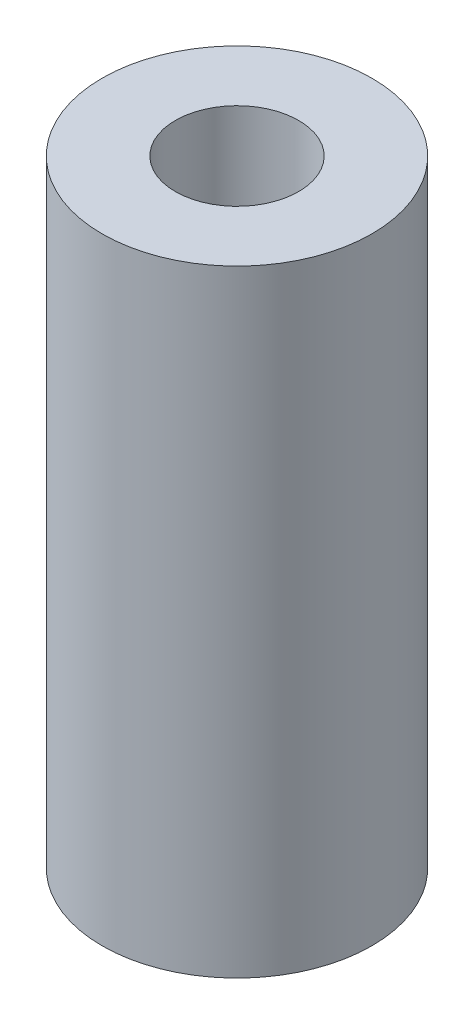
ISO-10303-21;
HEADER;
FILE_DESCRIPTION(('STEP AP214'),'2;1');
FILE_NAME('part.step','',(''),(''),'','','');
FILE_SCHEMA(('AUTOMOTIVE_DESIGN { 1 0 10303 214 1 1 1 1 }'));
ENDSEC;
DATA;
#1=APPLICATION_CONTEXT('core data for automotive mechanical design processes');
#2=APPLICATION_PROTOCOL_DEFINITION('international standard','automotive_design',2000,#1);
#3=PRODUCT_CONTEXT('',#1,'mechanical');
#4=PRODUCT('Part','Part','',(#3));
#5=PRODUCT_RELATED_PRODUCT_CATEGORY('part','',(#4));
#6=PRODUCT_DEFINITION_FORMATION('','',#4);
#7=PRODUCT_DEFINITION_CONTEXT('part definition',#1,'design');
#8=PRODUCT_DEFINITION('design','',#6,#7);
#9=PRODUCT_DEFINITION_SHAPE('','',#8);
#10=(LENGTH_UNIT() NAMED_UNIT(*) SI_UNIT(.MILLI.,.METRE.));
#11=(NAMED_UNIT(*) PLANE_ANGLE_UNIT() SI_UNIT($,.RADIAN.));
#12=(NAMED_UNIT(*) SI_UNIT($,.STERADIAN.) SOLID_ANGLE_UNIT());
#13=UNCERTAINTY_MEASURE_WITH_UNIT(LENGTH_MEASURE(1.E-05),#10,'distance_accuracy_value','');
#14=(GEOMETRIC_REPRESENTATION_CONTEXT(3) GLOBAL_UNCERTAINTY_ASSIGNED_CONTEXT((#13)) GLOBAL_UNIT_ASSIGNED_CONTEXT((#10,
#11,#12)) REPRESENTATION_CONTEXT('',''));
#15=CARTESIAN_POINT('',(0.,0.,0.));
#16=DIRECTION('',(0.,0.,1.));
#17=DIRECTION('',(1.,0.,0.));
#18=AXIS2_PLACEMENT_3D('',#15,#16,#17);
#19=CARTESIAN_POINT('',(0.,8.,0.));
#20=DIRECTION('',(0.,-1.,0.));
#21=DIRECTION('',(0.,0.,-1.));
#22=AXIS2_PLACEMENT_3D('',#19,#20,#21);
#23=PLANE('',#22);
#24=CARTESIAN_POINT('',(0.,8.,0.));
#25=DIRECTION('',(0.,-1.,0.));
#26=DIRECTION('',(0.,0.,-1.));
#27=AXIS2_PLACEMENT_3D('',#24,#25,#26);
#28=CIRCLE('',#27,1.75);
#29=CARTESIAN_POINT('',(0.,8.,-1.75));
#30=VERTEX_POINT('',#29);
#31=EDGE_CURVE('E10',#30,#30,#28,.T.);
#32=ORIENTED_EDGE('',*,*,#31,.F.);
#33=EDGE_LOOP('',(#32));
#34=FACE_BOUND('',#33,.T.);
#35=CARTESIAN_POINT('',(0.,8.,0.));
#36=DIRECTION('',(0.,1.,0.));
#37=DIRECTION('',(0.,0.,1.));
#38=AXIS2_PLACEMENT_3D('',#35,#36,#37);
#39=CIRCLE('',#38,0.799999999999999);
#40=CARTESIAN_POINT('',(0.,8.,0.799999999999999));
#41=VERTEX_POINT('',#40);
#42=EDGE_CURVE('E48',#41,#41,#39,.T.);
#43=ORIENTED_EDGE('',*,*,#42,.F.);
#44=EDGE_LOOP('',(#43));
#45=FACE_BOUND('',#44,.T.);
#46=ADVANCED_FACE('F34',(#34,#45),#23,.F.);
#47=CARTESIAN_POINT('',(0.,0.,0.));
#48=DIRECTION('',(0.,-1.,0.));
#49=DIRECTION('',(0.,0.,-1.));
#50=AXIS2_PLACEMENT_3D('',#47,#48,#49);
#51=CYLINDRICAL_SURFACE('',#50,1.75);
#52=CARTESIAN_POINT('',(0.,0.,0.));
#53=DIRECTION('',(0.,-1.,0.));
#54=DIRECTION('',(0.,0.,-1.));
#55=AXIS2_PLACEMENT_3D('',#52,#53,#54);
#56=CIRCLE('',#55,1.75);
#57=CARTESIAN_POINT('',(0.,0.,-1.75));
#58=VERTEX_POINT('',#57);
#59=EDGE_CURVE('E40',#58,#58,#56,.T.);
#60=ORIENTED_EDGE('',*,*,#59,.F.);
#61=EDGE_LOOP('',(#60));
#62=FACE_BOUND('',#61,.T.);
#63=ORIENTED_EDGE('',*,*,#31,.T.);
#64=EDGE_LOOP('',(#63));
#65=FACE_BOUND('',#64,.T.);
#66=ADVANCED_FACE('F57',(#62,#65),#51,.T.);
#67=CARTESIAN_POINT('',(0.,0.,0.));
#68=DIRECTION('',(0.,1.,0.));
#69=DIRECTION('',(0.,0.,1.));
#70=AXIS2_PLACEMENT_3D('',#67,#68,#69);
#71=PLANE('',#70);
#72=CARTESIAN_POINT('',(0.,0.,0.));
#73=DIRECTION('',(0.,1.,0.));
#74=DIRECTION('',(0.,0.,1.));
#75=AXIS2_PLACEMENT_3D('',#72,#73,#74);
#76=CIRCLE('',#75,0.799999999999998);
#77=CARTESIAN_POINT('',(0.,0.,0.799999999999998));
#78=VERTEX_POINT('',#77);
#79=EDGE_CURVE('E44',#78,#78,#76,.T.);
#80=ORIENTED_EDGE('',*,*,#79,.T.);
#81=EDGE_LOOP('',(#80));
#82=FACE_BOUND('',#81,.T.);
#83=ORIENTED_EDGE('',*,*,#59,.T.);
#84=EDGE_LOOP('',(#83));
#85=FACE_BOUND('',#84,.T.);
#86=ADVANCED_FACE('F62',(#82,#85),#71,.F.);
#87=CARTESIAN_POINT('',(0.,8.,0.));
#88=DIRECTION('',(0.,1.,0.));
#89=DIRECTION('',(0.,0.,1.));
#90=AXIS2_PLACEMENT_3D('',#87,#88,#89);
#91=CYLINDRICAL_SURFACE('',#90,0.799999999999998);
#92=ORIENTED_EDGE('',*,*,#79,.F.);
#93=EDGE_LOOP('',(#92));
#94=FACE_BOUND('',#93,.T.);
#95=ORIENTED_EDGE('',*,*,#42,.T.);
#96=EDGE_LOOP('',(#95));
#97=FACE_BOUND('',#96,.T.);
#98=ADVANCED_FACE('F54',(#94,#97),#91,.F.);
#99=CLOSED_SHELL('',(#46,#66,#86,#98));
#100=MANIFOLD_SOLID_BREP('B2',#99);
#101=ADVANCED_BREP_SHAPE_REPRESENTATION('',(#18,#100),#14);
#102=SHAPE_DEFINITION_REPRESENTATION(#9,#101);
ENDSEC;
END-ISO-10303-21;
